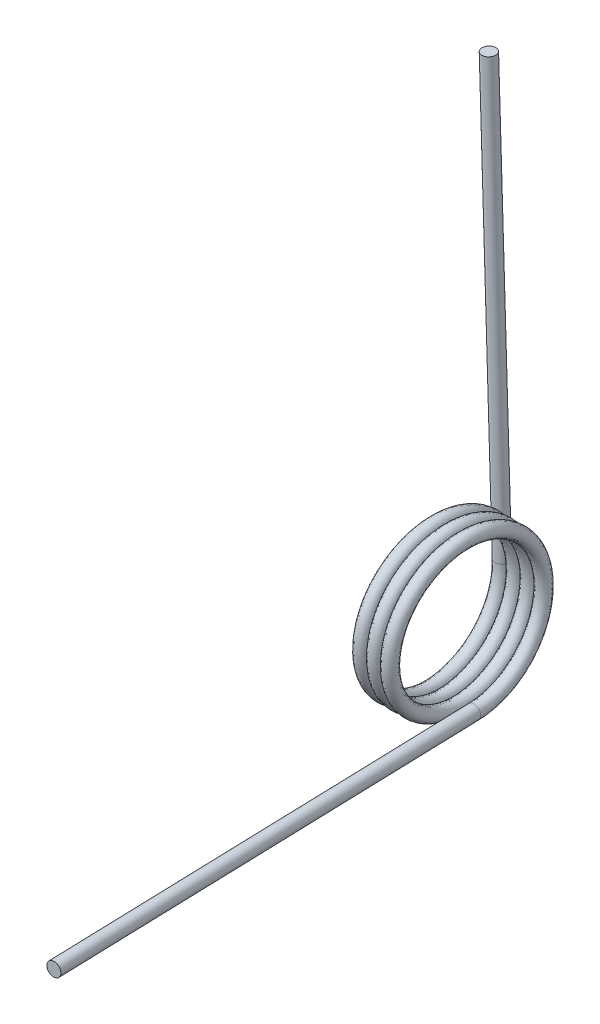
ISO-10303-21;
HEADER;
FILE_DESCRIPTION(('STEP AP214'),'2;1');
FILE_NAME('part.step','',(''),(''),'','','');
FILE_SCHEMA(('AUTOMOTIVE_DESIGN { 1 0 10303 214 1 1 1 1 }'));
ENDSEC;
DATA;
#1=APPLICATION_CONTEXT('core data for automotive mechanical design processes');
#2=APPLICATION_PROTOCOL_DEFINITION('international standard','automotive_design',2000,#1);
#3=PRODUCT_CONTEXT('',#1,'mechanical');
#4=PRODUCT('Part','Part','',(#3));
#5=PRODUCT_RELATED_PRODUCT_CATEGORY('part','',(#4));
#6=PRODUCT_DEFINITION_FORMATION('','',#4);
#7=PRODUCT_DEFINITION_CONTEXT('part definition',#1,'design');
#8=PRODUCT_DEFINITION('design','',#6,#7);
#9=PRODUCT_DEFINITION_SHAPE('','',#8);
#10=(LENGTH_UNIT() NAMED_UNIT(*) SI_UNIT(.MILLI.,.METRE.));
#11=(NAMED_UNIT(*) PLANE_ANGLE_UNIT() SI_UNIT($,.RADIAN.));
#12=(NAMED_UNIT(*) SI_UNIT($,.STERADIAN.) SOLID_ANGLE_UNIT());
#13=UNCERTAINTY_MEASURE_WITH_UNIT(LENGTH_MEASURE(1.E-05),#10,'distance_accuracy_value','');
#14=(GEOMETRIC_REPRESENTATION_CONTEXT(3) GLOBAL_UNCERTAINTY_ASSIGNED_CONTEXT((#13)) GLOBAL_UNIT_ASSIGNED_CONTEXT((#10,
#11,#12)) REPRESENTATION_CONTEXT('',''));
#15=CARTESIAN_POINT('',(0.,0.,0.));
#16=DIRECTION('',(0.,0.,1.));
#17=DIRECTION('',(1.,0.,0.));
#18=AXIS2_PLACEMENT_3D('',#15,#16,#17);
#19=CARTESIAN_POINT('',(1.20595359726786,0.0363066279997727,-12.8905));
#20=CARTESIAN_POINT('',(1.40915359726786,-7.4060270169891,-12.911461641449));
#21=CARTESIAN_POINT('',(1.61235359726786,-11.1453471534834,-6.47669246217356));
#22=CARTESIAN_POINT('',(1.81555359726786,-14.8846672899777,-0.0419232828980737));
#23=CARTESIAN_POINT('',(2.01875359726786,-11.1816537814832,6.41380753782644));
#24=CARTESIAN_POINT('',(2.22195359726786,-7.47864027298865,12.869538358551));
#25=CARTESIAN_POINT('',(2.42515359726785,-0.0363066279997743,12.8905));
#26=CARTESIAN_POINT('',(2.62835359726785,7.40602701698909,12.911461641449));
#27=CARTESIAN_POINT('',(2.83155359726785,11.1453471534834,6.47669246217356));
#28=CARTESIAN_POINT('',(3.03475359726785,14.8846672899777,0.0419232828980755));
#29=CARTESIAN_POINT('',(3.23795359726785,11.1816537814832,-6.41380753782644));
#30=CARTESIAN_POINT('',(3.44115359726785,7.47864027298865,-12.869538358551));
#31=CARTESIAN_POINT('',(3.64435359726785,0.0363066279997727,-12.8905));
#32=CARTESIAN_POINT('',(3.84755359726785,-7.4060270169891,-12.911461641449));
#33=CARTESIAN_POINT('',(4.05075359726785,-11.1453471534834,-6.47669246217356));
#34=CARTESIAN_POINT('',(4.25395359726785,-14.8846672899777,-0.0419232828980737));
#35=CARTESIAN_POINT('',(4.45715359726785,-11.1816537814832,6.41380753782644));
#36=CARTESIAN_POINT('',(4.66035359726785,-7.47864027298865,12.869538358551));
#37=CARTESIAN_POINT('',(4.86355359726785,-0.0363066279997743,12.8905));
#38=CARTESIAN_POINT('',(5.06675359726785,7.40602701698909,12.911461641449));
#39=CARTESIAN_POINT('',(5.26995359726785,11.1453471534834,6.47669246217356));
#40=CARTESIAN_POINT('',(5.47315359726785,14.8846672899777,0.0419232828980755));
#41=CARTESIAN_POINT('',(5.67635359726785,11.1816537814832,-6.41380753782644));
#42=CARTESIAN_POINT('',(5.87955359726785,7.47864027298865,-12.869538358551));
#43=CARTESIAN_POINT('',(6.08275359726785,0.0363066279997727,-12.8905));
#44=CARTESIAN_POINT('',(6.28595359726785,-7.4060270169891,-12.911461641449));
#45=CARTESIAN_POINT('',(6.48915359726784,-11.1453471534834,-6.47669246217356));
#46=CARTESIAN_POINT('',(6.69235359726784,-14.8846672899777,-0.0419232828980737));
#47=CARTESIAN_POINT('',(6.89555359726784,-11.1816537814832,6.41380753782644));
#48=CARTESIAN_POINT('',(7.09875359726784,-7.47864027298865,12.869538358551));
#49=CARTESIAN_POINT('',(7.30195359726784,-0.0363066279997743,12.8905));
#50=CARTESIAN_POINT('',(7.50515359726784,7.40602701698909,12.911461641449));
#51=CARTESIAN_POINT('',(7.70835359726784,11.1453471534834,6.47669246217356));
#52=CARTESIAN_POINT('',(7.91155359726784,14.8846672899777,0.0419232828980755));
#53=CARTESIAN_POINT('',(8.11475359726784,11.1816537814832,-6.41380753782644));
#54=CARTESIAN_POINT('',(8.31795359726784,7.47864027298865,-12.869538358551));
#55=CARTESIAN_POINT('',(8.52115359726784,0.0363066279997727,-12.8905));
#56=CARTESIAN_POINT('',(8.72435359726784,-7.4060270169891,-12.911461641449));
#57=CARTESIAN_POINT('',(8.92755359726784,-11.1453471534834,-6.47669246217356));
#58=CARTESIAN_POINT('',(9.13075359726784,-14.8846672899777,-0.0419232828980737));
#59=CARTESIAN_POINT('',(9.33395359726784,-11.1816537814832,6.41380753782644));
#60=CARTESIAN_POINT('',(9.53715359726784,-7.47864027298865,12.869538358551));
#61=CARTESIAN_POINT('',(9.74035359726784,-0.0363066279997743,12.8905));
#62=CARTESIAN_POINT('',(9.94355359726783,7.40602701698909,12.911461641449));
#63=CARTESIAN_POINT('',(10.1467535972678,11.1453471534834,6.47669246217356));
#64=CARTESIAN_POINT('',(10.3499535972678,14.8846672899777,0.0419232828980755));
#65=CARTESIAN_POINT('',(10.5531535972678,11.1816537814832,-6.41380753782644));
#66=CARTESIAN_POINT('',(10.7563535972678,7.47864027298865,-12.869538358551));
#67=CARTESIAN_POINT('',(10.9595535972678,0.0363066279997727,-12.8905));
#68=CARTESIAN_POINT('',(1.20595359726786,0.0363066279997727,-10.4775));
#69=CARTESIAN_POINT('',(1.40915359726786,-6.01288081743453,-10.498461641449));
#70=CARTESIAN_POINT('',(1.61235359726786,-9.05562785415157,-5.27019246217355));
#71=CARTESIAN_POINT('',(1.81555359726786,-12.0983748908686,-0.0419232828980735));
#72=CARTESIAN_POINT('',(2.01875359726786,-9.09193448215134,5.20730753782644));
#73=CARTESIAN_POINT('',(2.22195359726786,-6.08549407343408,10.456538358551));
#74=CARTESIAN_POINT('',(2.42515359726785,-0.036306627999774,10.4775));
#75=CARTESIAN_POINT('',(2.62835359726785,6.01288081743453,10.498461641449));
#76=CARTESIAN_POINT('',(2.83155359726785,9.05562785415156,5.27019246217356));
#77=CARTESIAN_POINT('',(3.03475359726785,12.0983748908686,0.041923282898075));
#78=CARTESIAN_POINT('',(3.23795359726785,9.09193448215135,-5.20730753782644));
#79=CARTESIAN_POINT('',(3.44115359726785,6.08549407343408,-10.456538358551));
#80=CARTESIAN_POINT('',(3.64435359726785,0.0363066279997727,-10.4775));
#81=CARTESIAN_POINT('',(3.84755359726785,-6.01288081743453,-10.498461641449));
#82=CARTESIAN_POINT('',(4.05075359726785,-9.05562785415157,-5.27019246217355));
#83=CARTESIAN_POINT('',(4.25395359726785,-12.0983748908686,-0.0419232828980735));
#84=CARTESIAN_POINT('',(4.45715359726785,-9.09193448215134,5.20730753782644));
#85=CARTESIAN_POINT('',(4.66035359726785,-6.08549407343408,10.456538358551));
#86=CARTESIAN_POINT('',(4.86355359726785,-0.036306627999774,10.4775));
#87=CARTESIAN_POINT('',(5.06675359726785,6.01288081743453,10.498461641449));
#88=CARTESIAN_POINT('',(5.26995359726785,9.05562785415156,5.27019246217356));
#89=CARTESIAN_POINT('',(5.47315359726785,12.0983748908686,0.041923282898075));
#90=CARTESIAN_POINT('',(5.67635359726785,9.09193448215135,-5.20730753782644));
#91=CARTESIAN_POINT('',(5.87955359726785,6.08549407343408,-10.456538358551));
#92=CARTESIAN_POINT('',(6.08275359726785,0.0363066279997727,-10.4775));
#93=CARTESIAN_POINT('',(6.28595359726785,-6.01288081743453,-10.498461641449));
#94=CARTESIAN_POINT('',(6.48915359726785,-9.05562785415157,-5.27019246217355));
#95=CARTESIAN_POINT('',(6.69235359726784,-12.0983748908686,-0.0419232828980735));
#96=CARTESIAN_POINT('',(6.89555359726784,-9.09193448215134,5.20730753782644));
#97=CARTESIAN_POINT('',(7.09875359726784,-6.08549407343408,10.456538358551));
#98=CARTESIAN_POINT('',(7.30195359726784,-0.036306627999774,10.4775));
#99=CARTESIAN_POINT('',(7.50515359726784,6.01288081743453,10.498461641449));
#100=CARTESIAN_POINT('',(7.70835359726784,9.05562785415156,5.27019246217356));
#101=CARTESIAN_POINT('',(7.91155359726784,12.0983748908686,0.041923282898075));
#102=CARTESIAN_POINT('',(8.11475359726784,9.09193448215135,-5.20730753782644));
#103=CARTESIAN_POINT('',(8.31795359726784,6.08549407343408,-10.456538358551));
#104=CARTESIAN_POINT('',(8.52115359726784,0.0363066279997727,-10.4775));
#105=CARTESIAN_POINT('',(8.72435359726784,-6.01288081743453,-10.498461641449));
#106=CARTESIAN_POINT('',(8.92755359726784,-9.05562785415157,-5.27019246217355));
#107=CARTESIAN_POINT('',(9.13075359726784,-12.0983748908686,-0.0419232828980735));
#108=CARTESIAN_POINT('',(9.33395359726784,-9.09193448215134,5.20730753782644));
#109=CARTESIAN_POINT('',(9.53715359726784,-6.08549407343408,10.456538358551));
#110=CARTESIAN_POINT('',(9.74035359726784,-0.036306627999774,10.4775));
#111=CARTESIAN_POINT('',(9.94355359726784,6.01288081743453,10.498461641449));
#112=CARTESIAN_POINT('',(10.1467535972678,9.05562785415156,5.27019246217356));
#113=CARTESIAN_POINT('',(10.3499535972678,12.0983748908686,0.041923282898075));
#114=CARTESIAN_POINT('',(10.5531535972678,9.09193448215135,-5.20730753782644));
#115=CARTESIAN_POINT('',(10.7563535972678,6.08549407343408,-10.456538358551));
#116=CARTESIAN_POINT('',(10.9595535972678,0.0363066279997727,-10.4775));
#117=CARTESIAN_POINT('',(-1.20595359726786,-0.0363066279997727,-10.4775));
#118=CARTESIAN_POINT('',(-1.00275359726786,-6.08549407343408,-10.456538358551));
#119=CARTESIAN_POINT('',(-0.799553597267859,-9.09193448215134,-5.20730753782645));
#120=CARTESIAN_POINT('',(-0.596353597267859,-12.0983748908686,0.041923282898072));
#121=CARTESIAN_POINT('',(-0.39315359726786,-9.05562785415157,5.27019246217355));
#122=CARTESIAN_POINT('',(-0.18995359726786,-6.01288081743453,10.498461641449));
#123=CARTESIAN_POINT('',(0.0132464027321393,0.0363066279997714,10.4775));
#124=CARTESIAN_POINT('',(0.216446402732139,6.08549407343407,10.456538358551));
#125=CARTESIAN_POINT('',(0.419646402732138,9.09193448215134,5.20730753782645));
#126=CARTESIAN_POINT('',(0.622846402732138,12.0983748908686,-0.0419232828980705));
#127=CARTESIAN_POINT('',(0.826046402732137,9.05562785415157,-5.27019246217355));
#128=CARTESIAN_POINT('',(1.02924640273214,6.01288081743454,-10.498461641449));
#129=CARTESIAN_POINT('',(1.23244640273214,-0.0363066279997727,-10.4775));
#130=CARTESIAN_POINT('',(1.43564640273214,-6.08549407343408,-10.456538358551));
#131=CARTESIAN_POINT('',(1.63884640273214,-9.09193448215134,-5.20730753782645));
#132=CARTESIAN_POINT('',(1.84204640273213,-12.0983748908686,0.041923282898072));
#133=CARTESIAN_POINT('',(2.04524640273213,-9.05562785415157,5.27019246217355));
#134=CARTESIAN_POINT('',(2.24844640273213,-6.01288081743453,10.498461641449));
#135=CARTESIAN_POINT('',(2.45164640273213,0.0363066279997714,10.4775));
#136=CARTESIAN_POINT('',(2.65484640273213,6.08549407343407,10.456538358551));
#137=CARTESIAN_POINT('',(2.85804640273213,9.09193448215134,5.20730753782645));
#138=CARTESIAN_POINT('',(3.06124640273213,12.0983748908686,-0.0419232828980705));
#139=CARTESIAN_POINT('',(3.26444640273213,9.05562785415157,-5.27019246217355));
#140=CARTESIAN_POINT('',(3.46764640273213,6.01288081743454,-10.498461641449));
#141=CARTESIAN_POINT('',(3.67084640273213,-0.0363066279997727,-10.4775));
#142=CARTESIAN_POINT('',(3.87404640273213,-6.08549407343408,-10.456538358551));
#143=CARTESIAN_POINT('',(4.07724640273213,-9.09193448215134,-5.20730753782645));
#144=CARTESIAN_POINT('',(4.28044640273213,-12.0983748908686,0.041923282898072));
#145=CARTESIAN_POINT('',(4.48364640273213,-9.05562785415157,5.27019246217355));
#146=CARTESIAN_POINT('',(4.68684640273213,-6.01288081743453,10.498461641449));
#147=CARTESIAN_POINT('',(4.89004640273213,0.0363066279997714,10.4775));
#148=CARTESIAN_POINT('',(5.09324640273213,6.08549407343407,10.456538358551));
#149=CARTESIAN_POINT('',(5.29644640273213,9.09193448215134,5.20730753782645));
#150=CARTESIAN_POINT('',(5.49964640273213,12.0983748908686,-0.0419232828980705));
#151=CARTESIAN_POINT('',(5.70284640273213,9.05562785415157,-5.27019246217355));
#152=CARTESIAN_POINT('',(5.90604640273212,6.01288081743454,-10.498461641449));
#153=CARTESIAN_POINT('',(6.10924640273212,-0.0363066279997727,-10.4775));
#154=CARTESIAN_POINT('',(6.31244640273212,-6.08549407343408,-10.456538358551));
#155=CARTESIAN_POINT('',(6.51564640273212,-9.09193448215134,-5.20730753782645));
#156=CARTESIAN_POINT('',(6.71884640273212,-12.0983748908686,0.041923282898072));
#157=CARTESIAN_POINT('',(6.92204640273212,-9.05562785415157,5.27019246217355));
#158=CARTESIAN_POINT('',(7.12524640273212,-6.01288081743453,10.498461641449));
#159=CARTESIAN_POINT('',(7.32844640273212,0.0363066279997714,10.4775));
#160=CARTESIAN_POINT('',(7.53164640273212,6.08549407343407,10.456538358551));
#161=CARTESIAN_POINT('',(7.73484640273212,9.09193448215134,5.20730753782645));
#162=CARTESIAN_POINT('',(7.93804640273212,12.0983748908686,-0.0419232828980705));
#163=CARTESIAN_POINT('',(8.14124640273212,9.05562785415157,-5.27019246217355));
#164=CARTESIAN_POINT('',(8.34444640273212,6.01288081743454,-10.498461641449));
#165=CARTESIAN_POINT('',(8.54764640273212,-0.0363066279997727,-10.4775));
#166=CARTESIAN_POINT('',(-1.20595359726786,-0.0363066279997727,-12.8905));
#167=CARTESIAN_POINT('',(-1.00275359726786,-7.47864027298864,-12.869538358551));
#168=CARTESIAN_POINT('',(-0.799553597267859,-11.1816537814832,-6.41380753782645));
#169=CARTESIAN_POINT('',(-0.596353597267859,-14.8846672899777,0.0419232828980719));
#170=CARTESIAN_POINT('',(-0.39315359726786,-11.1453471534834,6.47669246217355));
#171=CARTESIAN_POINT('',(-0.18995359726786,-7.4060270169891,12.911461641449));
#172=CARTESIAN_POINT('',(0.013246402732139,0.0363066279997711,12.8905));
#173=CARTESIAN_POINT('',(0.216446402732139,7.47864027298864,12.869538358551));
#174=CARTESIAN_POINT('',(0.419646402732138,11.1816537814832,6.41380753782645));
#175=CARTESIAN_POINT('',(0.622846402732138,14.8846672899777,-0.04192328289807));
#176=CARTESIAN_POINT('',(0.826046402732137,11.1453471534834,-6.47669246217354));
#177=CARTESIAN_POINT('',(1.02924640273214,7.4060270169891,-12.911461641449));
#178=CARTESIAN_POINT('',(1.23244640273214,-0.0363066279997727,-12.8905));
#179=CARTESIAN_POINT('',(1.43564640273214,-7.47864027298864,-12.869538358551));
#180=CARTESIAN_POINT('',(1.63884640273213,-11.1816537814832,-6.41380753782645));
#181=CARTESIAN_POINT('',(1.84204640273213,-14.8846672899777,0.0419232828980719));
#182=CARTESIAN_POINT('',(2.04524640273213,-11.1453471534834,6.47669246217355));
#183=CARTESIAN_POINT('',(2.24844640273213,-7.4060270169891,12.911461641449));
#184=CARTESIAN_POINT('',(2.45164640273213,0.0363066279997711,12.8905));
#185=CARTESIAN_POINT('',(2.65484640273213,7.47864027298864,12.869538358551));
#186=CARTESIAN_POINT('',(2.85804640273213,11.1816537814832,6.41380753782645));
#187=CARTESIAN_POINT('',(3.06124640273213,14.8846672899777,-0.04192328289807));
#188=CARTESIAN_POINT('',(3.26444640273213,11.1453471534834,-6.47669246217354));
#189=CARTESIAN_POINT('',(3.46764640273213,7.4060270169891,-12.911461641449));
#190=CARTESIAN_POINT('',(3.67084640273213,-0.0363066279997727,-12.8905));
#191=CARTESIAN_POINT('',(3.87404640273213,-7.47864027298864,-12.869538358551));
#192=CARTESIAN_POINT('',(4.07724640273213,-11.1816537814832,-6.41380753782645));
#193=CARTESIAN_POINT('',(4.28044640273213,-14.8846672899777,0.0419232828980719));
#194=CARTESIAN_POINT('',(4.48364640273213,-11.1453471534834,6.47669246217355));
#195=CARTESIAN_POINT('',(4.68684640273213,-7.4060270169891,12.911461641449));
#196=CARTESIAN_POINT('',(4.89004640273213,0.0363066279997711,12.8905));
#197=CARTESIAN_POINT('',(5.09324640273213,7.47864027298864,12.869538358551));
#198=CARTESIAN_POINT('',(5.29644640273213,11.1816537814832,6.41380753782645));
#199=CARTESIAN_POINT('',(5.49964640273213,14.8846672899777,-0.04192328289807));
#200=CARTESIAN_POINT('',(5.70284640273213,11.1453471534834,-6.47669246217354));
#201=CARTESIAN_POINT('',(5.90604640273212,7.4060270169891,-12.911461641449));
#202=CARTESIAN_POINT('',(6.10924640273212,-0.0363066279997727,-12.8905));
#203=CARTESIAN_POINT('',(6.31244640273212,-7.47864027298864,-12.869538358551));
#204=CARTESIAN_POINT('',(6.51564640273212,-11.1816537814832,-6.41380753782645));
#205=CARTESIAN_POINT('',(6.71884640273212,-14.8846672899777,0.0419232828980719));
#206=CARTESIAN_POINT('',(6.92204640273212,-11.1453471534834,6.47669246217355));
#207=CARTESIAN_POINT('',(7.12524640273212,-7.4060270169891,12.911461641449));
#208=CARTESIAN_POINT('',(7.32844640273212,0.0363066279997711,12.8905));
#209=CARTESIAN_POINT('',(7.53164640273212,7.47864027298864,12.869538358551));
#210=CARTESIAN_POINT('',(7.73484640273212,11.1816537814832,6.41380753782645));
#211=CARTESIAN_POINT('',(7.93804640273212,14.8846672899777,-0.04192328289807));
#212=CARTESIAN_POINT('',(8.14124640273212,11.1453471534834,-6.47669246217354));
#213=CARTESIAN_POINT('',(8.34444640273212,7.4060270169891,-12.911461641449));
#214=CARTESIAN_POINT('',(8.54764640273212,-0.0363066279997727,-12.8905));
#215=CARTESIAN_POINT('',(-1.20595359726786,-0.0363066279997727,-15.3035));
#216=CARTESIAN_POINT('',(-1.00275359726786,-8.87178647254321,-15.282538358551));
#217=CARTESIAN_POINT('',(-0.799553597267859,-13.271373080815,-7.62030753782645));
#218=CARTESIAN_POINT('',(-0.59635359726786,-17.6709596890869,0.0419232828980717));
#219=CARTESIAN_POINT('',(-0.39315359726786,-13.2350664528153,7.68319246217355));
#220=CARTESIAN_POINT('',(-0.189953597267861,-8.79917321654367,15.324461641449));
#221=CARTESIAN_POINT('',(0.0132464027321388,0.0363066279997709,15.3035));
#222=CARTESIAN_POINT('',(0.216446402732138,8.8717864725432,15.282538358551));
#223=CARTESIAN_POINT('',(0.419646402732138,13.271373080815,7.62030753782645));
#224=CARTESIAN_POINT('',(0.622846402732137,17.6709596890869,-0.0419232828980695));
#225=CARTESIAN_POINT('',(0.826046402732137,13.2350664528153,-7.68319246217354));
#226=CARTESIAN_POINT('',(1.02924640273214,8.79917321654367,-15.324461641449));
#227=CARTESIAN_POINT('',(1.23244640273214,-0.0363066279997727,-15.3035));
#228=CARTESIAN_POINT('',(1.43564640273214,-8.87178647254321,-15.282538358551));
#229=CARTESIAN_POINT('',(1.63884640273213,-13.271373080815,-7.62030753782645));
#230=CARTESIAN_POINT('',(1.84204640273213,-17.6709596890869,0.0419232828980717));
#231=CARTESIAN_POINT('',(2.04524640273213,-13.2350664528153,7.68319246217355));
#232=CARTESIAN_POINT('',(2.24844640273213,-8.79917321654367,15.324461641449));
#233=CARTESIAN_POINT('',(2.45164640273213,0.0363066279997709,15.3035));
#234=CARTESIAN_POINT('',(2.65484640273213,8.8717864725432,15.282538358551));
#235=CARTESIAN_POINT('',(2.85804640273213,13.271373080815,7.62030753782645));
#236=CARTESIAN_POINT('',(3.06124640273213,17.6709596890869,-0.0419232828980695));
#237=CARTESIAN_POINT('',(3.26444640273213,13.2350664528153,-7.68319246217354));
#238=CARTESIAN_POINT('',(3.46764640273213,8.79917321654367,-15.324461641449));
#239=CARTESIAN_POINT('',(3.67084640273213,-0.0363066279997727,-15.3035));
#240=CARTESIAN_POINT('',(3.87404640273213,-8.87178647254321,-15.282538358551));
#241=CARTESIAN_POINT('',(4.07724640273213,-13.271373080815,-7.62030753782645));
#242=CARTESIAN_POINT('',(4.28044640273213,-17.6709596890869,0.0419232828980717));
#243=CARTESIAN_POINT('',(4.48364640273213,-13.2350664528153,7.68319246217355));
#244=CARTESIAN_POINT('',(4.68684640273213,-8.79917321654367,15.324461641449));
#245=CARTESIAN_POINT('',(4.89004640273213,0.0363066279997709,15.3035));
#246=CARTESIAN_POINT('',(5.09324640273213,8.8717864725432,15.282538358551));
#247=CARTESIAN_POINT('',(5.29644640273213,13.271373080815,7.62030753782645));
#248=CARTESIAN_POINT('',(5.49964640273213,17.6709596890869,-0.0419232828980695));
#249=CARTESIAN_POINT('',(5.70284640273213,13.2350664528153,-7.68319246217354));
#250=CARTESIAN_POINT('',(5.90604640273212,8.79917321654367,-15.324461641449));
#251=CARTESIAN_POINT('',(6.10924640273212,-0.0363066279997727,-15.3035));
#252=CARTESIAN_POINT('',(6.31244640273212,-8.87178647254321,-15.282538358551));
#253=CARTESIAN_POINT('',(6.51564640273212,-13.271373080815,-7.62030753782645));
#254=CARTESIAN_POINT('',(6.71884640273212,-17.6709596890869,0.0419232828980717));
#255=CARTESIAN_POINT('',(6.92204640273212,-13.2350664528153,7.68319246217355));
#256=CARTESIAN_POINT('',(7.12524640273212,-8.79917321654367,15.324461641449));
#257=CARTESIAN_POINT('',(7.32844640273212,0.0363066279997709,15.3035));
#258=CARTESIAN_POINT('',(7.53164640273212,8.8717864725432,15.282538358551));
#259=CARTESIAN_POINT('',(7.73484640273212,13.271373080815,7.62030753782645));
#260=CARTESIAN_POINT('',(7.93804640273212,17.6709596890869,-0.0419232828980695));
#261=CARTESIAN_POINT('',(8.14124640273212,13.2350664528153,-7.68319246217354));
#262=CARTESIAN_POINT('',(8.34444640273212,8.79917321654367,-15.324461641449));
#263=CARTESIAN_POINT('',(8.54764640273212,-0.0363066279997727,-15.3035));
#264=CARTESIAN_POINT('',(1.20595359726786,0.0363066279997727,-15.3035));
#265=CARTESIAN_POINT('',(1.40915359726786,-8.79917321654366,-15.324461641449));
#266=CARTESIAN_POINT('',(1.61235359726786,-13.2350664528153,-7.68319246217356));
#267=CARTESIAN_POINT('',(1.81555359726786,-17.6709596890869,-0.0419232828980739));
#268=CARTESIAN_POINT('',(2.01875359726786,-13.271373080815,7.62030753782644));
#269=CARTESIAN_POINT('',(2.22195359726786,-8.87178647254322,15.282538358551));
#270=CARTESIAN_POINT('',(2.42515359726785,-0.0363066279997746,15.3035));
#271=CARTESIAN_POINT('',(2.62835359726785,8.79917321654366,15.324461641449));
#272=CARTESIAN_POINT('',(2.83155359726785,13.2350664528153,7.68319246217356));
#273=CARTESIAN_POINT('',(3.03475359726785,17.6709596890869,0.041923282898076));
#274=CARTESIAN_POINT('',(3.23795359726785,13.271373080815,-7.62030753782643));
#275=CARTESIAN_POINT('',(3.44115359726785,8.87178647254322,-15.282538358551));
#276=CARTESIAN_POINT('',(3.64435359726785,0.0363066279997727,-15.3035));
#277=CARTESIAN_POINT('',(3.84755359726785,-8.79917321654366,-15.324461641449));
#278=CARTESIAN_POINT('',(4.05075359726785,-13.2350664528153,-7.68319246217356));
#279=CARTESIAN_POINT('',(4.25395359726785,-17.6709596890869,-0.0419232828980739));
#280=CARTESIAN_POINT('',(4.45715359726785,-13.271373080815,7.62030753782644));
#281=CARTESIAN_POINT('',(4.66035359726785,-8.87178647254322,15.282538358551));
#282=CARTESIAN_POINT('',(4.86355359726785,-0.0363066279997746,15.3035));
#283=CARTESIAN_POINT('',(5.06675359726785,8.79917321654366,15.324461641449));
#284=CARTESIAN_POINT('',(5.26995359726785,13.2350664528153,7.68319246217356));
#285=CARTESIAN_POINT('',(5.47315359726785,17.6709596890869,0.041923282898076));
#286=CARTESIAN_POINT('',(5.67635359726785,13.271373080815,-7.62030753782643));
#287=CARTESIAN_POINT('',(5.87955359726785,8.87178647254322,-15.282538358551));
#288=CARTESIAN_POINT('',(6.08275359726785,0.0363066279997727,-15.3035));
#289=CARTESIAN_POINT('',(6.28595359726785,-8.79917321654366,-15.324461641449));
#290=CARTESIAN_POINT('',(6.48915359726785,-13.2350664528153,-7.68319246217356));
#291=CARTESIAN_POINT('',(6.69235359726784,-17.6709596890869,-0.0419232828980739));
#292=CARTESIAN_POINT('',(6.89555359726784,-13.271373080815,7.62030753782644));
#293=CARTESIAN_POINT('',(7.09875359726784,-8.87178647254322,15.282538358551));
#294=CARTESIAN_POINT('',(7.30195359726784,-0.0363066279997746,15.3035));
#295=CARTESIAN_POINT('',(7.50515359726784,8.79917321654366,15.324461641449));
#296=CARTESIAN_POINT('',(7.70835359726784,13.2350664528153,7.68319246217356));
#297=CARTESIAN_POINT('',(7.91155359726784,17.6709596890869,0.041923282898076));
#298=CARTESIAN_POINT('',(8.11475359726784,13.271373080815,-7.62030753782643));
#299=CARTESIAN_POINT('',(8.31795359726784,8.87178647254322,-15.282538358551));
#300=CARTESIAN_POINT('',(8.52115359726784,0.0363066279997727,-15.3035));
#301=CARTESIAN_POINT('',(8.72435359726784,-8.79917321654366,-15.324461641449));
#302=CARTESIAN_POINT('',(8.92755359726784,-13.2350664528153,-7.68319246217356));
#303=CARTESIAN_POINT('',(9.13075359726784,-17.6709596890869,-0.0419232828980739));
#304=CARTESIAN_POINT('',(9.33395359726784,-13.271373080815,7.62030753782644));
#305=CARTESIAN_POINT('',(9.53715359726784,-8.87178647254322,15.282538358551));
#306=CARTESIAN_POINT('',(9.74035359726784,-0.0363066279997746,15.3035));
#307=CARTESIAN_POINT('',(9.94355359726784,8.79917321654366,15.324461641449));
#308=CARTESIAN_POINT('',(10.1467535972678,13.2350664528153,7.68319246217356));
#309=CARTESIAN_POINT('',(10.3499535972678,17.6709596890869,0.041923282898076));
#310=CARTESIAN_POINT('',(10.5531535972678,13.271373080815,-7.62030753782643));
#311=CARTESIAN_POINT('',(10.7563535972678,8.87178647254322,-15.282538358551));
#312=CARTESIAN_POINT('',(10.9595535972678,0.0363066279997727,-15.3035));
#313=CARTESIAN_POINT('',(1.20595359726786,0.0363066279997727,-12.8905));
#314=CARTESIAN_POINT('',(1.40915359726786,-7.4060270169891,-12.911461641449));
#315=CARTESIAN_POINT('',(1.61235359726786,-11.1453471534834,-6.47669246217356));
#316=CARTESIAN_POINT('',(1.81555359726786,-14.8846672899777,-0.0419232828980737));
#317=CARTESIAN_POINT('',(2.01875359726786,-11.1816537814832,6.41380753782644));
#318=CARTESIAN_POINT('',(2.22195359726786,-7.47864027298865,12.869538358551));
#319=CARTESIAN_POINT('',(2.42515359726785,-0.0363066279997743,12.8905));
#320=CARTESIAN_POINT('',(2.62835359726785,7.40602701698909,12.911461641449));
#321=CARTESIAN_POINT('',(2.83155359726785,11.1453471534834,6.47669246217356));
#322=CARTESIAN_POINT('',(3.03475359726785,14.8846672899777,0.0419232828980755));
#323=CARTESIAN_POINT('',(3.23795359726785,11.1816537814832,-6.41380753782644));
#324=CARTESIAN_POINT('',(3.44115359726785,7.47864027298865,-12.869538358551));
#325=CARTESIAN_POINT('',(3.64435359726785,0.0363066279997727,-12.8905));
#326=CARTESIAN_POINT('',(3.84755359726785,-7.4060270169891,-12.911461641449));
#327=CARTESIAN_POINT('',(4.05075359726785,-11.1453471534834,-6.47669246217356));
#328=CARTESIAN_POINT('',(4.25395359726785,-14.8846672899777,-0.0419232828980737));
#329=CARTESIAN_POINT('',(4.45715359726785,-11.1816537814832,6.41380753782644));
#330=CARTESIAN_POINT('',(4.66035359726785,-7.47864027298865,12.869538358551));
#331=CARTESIAN_POINT('',(4.86355359726785,-0.0363066279997743,12.8905));
#332=CARTESIAN_POINT('',(5.06675359726785,7.40602701698909,12.911461641449));
#333=CARTESIAN_POINT('',(5.26995359726785,11.1453471534834,6.47669246217356));
#334=CARTESIAN_POINT('',(5.47315359726785,14.8846672899777,0.0419232828980755));
#335=CARTESIAN_POINT('',(5.67635359726785,11.1816537814832,-6.41380753782644));
#336=CARTESIAN_POINT('',(5.87955359726785,7.47864027298865,-12.869538358551));
#337=CARTESIAN_POINT('',(6.08275359726785,0.0363066279997727,-12.8905));
#338=CARTESIAN_POINT('',(6.28595359726785,-7.4060270169891,-12.911461641449));
#339=CARTESIAN_POINT('',(6.48915359726784,-11.1453471534834,-6.47669246217356));
#340=CARTESIAN_POINT('',(6.69235359726784,-14.8846672899777,-0.0419232828980737));
#341=CARTESIAN_POINT('',(6.89555359726784,-11.1816537814832,6.41380753782644));
#342=CARTESIAN_POINT('',(7.09875359726784,-7.47864027298865,12.869538358551));
#343=CARTESIAN_POINT('',(7.30195359726784,-0.0363066279997743,12.8905));
#344=CARTESIAN_POINT('',(7.50515359726784,7.40602701698909,12.911461641449));
#345=CARTESIAN_POINT('',(7.70835359726784,11.1453471534834,6.47669246217356));
#346=CARTESIAN_POINT('',(7.91155359726784,14.8846672899777,0.0419232828980755));
#347=CARTESIAN_POINT('',(8.11475359726784,11.1816537814832,-6.41380753782644));
#348=CARTESIAN_POINT('',(8.31795359726784,7.47864027298865,-12.869538358551));
#349=CARTESIAN_POINT('',(8.52115359726784,0.0363066279997727,-12.8905));
#350=CARTESIAN_POINT('',(8.72435359726784,-7.4060270169891,-12.911461641449));
#351=CARTESIAN_POINT('',(8.92755359726784,-11.1453471534834,-6.47669246217356));
#352=CARTESIAN_POINT('',(9.13075359726784,-14.8846672899777,-0.0419232828980737));
#353=CARTESIAN_POINT('',(9.33395359726784,-11.1816537814832,6.41380753782644));
#354=CARTESIAN_POINT('',(9.53715359726784,-7.47864027298865,12.869538358551));
#355=CARTESIAN_POINT('',(9.74035359726784,-0.0363066279997743,12.8905));
#356=CARTESIAN_POINT('',(9.94355359726783,7.40602701698909,12.911461641449));
#357=CARTESIAN_POINT('',(10.1467535972678,11.1453471534834,6.47669246217356));
#358=CARTESIAN_POINT('',(10.3499535972678,14.8846672899777,0.0419232828980755));
#359=CARTESIAN_POINT('',(10.5531535972678,11.1816537814832,-6.41380753782644));
#360=CARTESIAN_POINT('',(10.7563535972678,7.47864027298865,-12.869538358551));
#361=CARTESIAN_POINT('',(10.9595535972678,0.0363066279997727,-12.8905));
#362=(BOUNDED_SURFACE() B_SPLINE_SURFACE(3,2,((#19,#20,#21,#22,#23,#24,#25,#26,#27,#28,#29,#30,
#31,#32,#33,#34,#35,#36,#37,#38,#39,#40,#41,#42,#43,#44,#45,#46,#47,#48,#49,#50,#51,#52,#53,#54,
#55,#56,#57,#58,#59,#60,#61,#62,#63,#64,#65,#66,#67),(#68,#69,#70,#71,#72,#73,#74,#75,#76,#77,
#78,#79,#80,#81,#82,#83,#84,#85,#86,#87,#88,#89,#90,#91,#92,#93,#94,#95,#96,#97,#98,#99,#100,
#101,#102,#103,#104,#105,#106,#107,#108,#109,#110,#111,#112,#113,#114,#115,#116),(#117,#118,
#119,#120,#121,#122,#123,#124,#125,#126,#127,#128,#129,#130,#131,#132,#133,#134,#135,#136,#137,
#138,#139,#140,#141,#142,#143,#144,#145,#146,#147,#148,#149,#150,#151,#152,#153,#154,#155,#156,
#157,#158,#159,#160,#161,#162,#163,#164,#165),(#166,#167,#168,#169,#170,#171,#172,#173,#174,
#175,#176,#177,#178,#179,#180,#181,#182,#183,#184,#185,#186,#187,#188,#189,#190,#191,#192,#193,
#194,#195,#196,#197,#198,#199,#200,#201,#202,#203,#204,#205,#206,#207,#208,#209,#210,#211,#212,
#213,#214),(#215,#216,#217,#218,#219,#220,#221,#222,#223,#224,#225,#226,#227,#228,#229,#230,
#231,#232,#233,#234,#235,#236,#237,#238,#239,#240,#241,#242,#243,#244,#245,#246,#247,#248,#249,
#250,#251,#252,#253,#254,#255,#256,#257,#258,#259,#260,#261,#262,#263),(#264,#265,#266,#267,
#268,#269,#270,#271,#272,#273,#274,#275,#276,#277,#278,#279,#280,#281,#282,#283,#284,#285,#286,
#287,#288,#289,#290,#291,#292,#293,#294,#295,#296,#297,#298,#299,#300,#301,#302,#303,#304,#305,
#306,#307,#308,#309,#310,#311,#312),(#313,#314,#315,#316,#317,#318,#319,#320,#321,#322,#323,
#324,#325,#326,#327,#328,#329,#330,#331,#332,#333,#334,#335,#336,#337,#338,#339,#340,#341,#342,
#343,#344,#345,#346,#347,#348,#349,#350,#351,#352,#353,#354,#355,#356,#357,#358,#359,#360,
#361)),.UNSPECIFIED.,.T.,.F.,.F.) B_SPLINE_SURFACE_WITH_KNOTS((4,3,4),(3,2,2,2,2,2,2,2,2,2,2,2,
2,2,2,2,2,2,2,2,2,2,2,2,3),(0.,0.5,1.),(0.,0.0416666666666667,0.0833333333333333,0.125,
0.166666666666667,0.208333333333333,0.25,0.291666666666667,0.333333333333333,0.375,
0.416666666666667,0.458333333333333,0.5,0.541666666666667,0.583333333333333,0.625,
0.666666666666667,0.708333333333333,0.75,0.791666666666667,0.833333333333333,0.875,
0.916666666666667,0.958333333333333,1.),
.UNSPECIFIED.) GEOMETRIC_REPRESENTATION_ITEM() RATIONAL_B_SPLINE_SURFACE(((1.,0.866025403784439,
1.,0.866025403784439,1.,0.866025403784439,1.,0.866025403784439,1.,0.866025403784439,1.,
0.866025403784439,1.,0.866025403784439,1.,0.866025403784439,1.,0.866025403784439,1.,
0.866025403784439,1.,0.866025403784439,1.,0.866025403784439,1.,0.866025403784439,1.,
0.866025403784439,1.,0.866025403784439,1.,0.866025403784439,1.,0.866025403784439,1.,
0.866025403784439,1.,0.866025403784439,1.,0.866025403784439,1.,0.866025403784439,1.,
0.866025403784439,1.,0.866025403784439,1.,0.866025403784439,1.),(0.333333333333333,
0.288675134594813,0.333333333333333,0.288675134594813,0.333333333333333,0.288675134594813,
0.333333333333333,0.288675134594813,0.333333333333333,0.288675134594813,0.333333333333333,
0.288675134594813,0.333333333333333,0.288675134594813,0.333333333333333,0.288675134594813,
0.333333333333333,0.288675134594813,0.333333333333333,0.288675134594813,0.333333333333333,
0.288675134594813,0.333333333333333,0.288675134594813,0.333333333333333,0.288675134594813,
0.333333333333333,0.288675134594813,0.333333333333333,0.288675134594813,0.333333333333333,
0.288675134594813,0.333333333333333,0.288675134594813,0.333333333333333,0.288675134594813,
0.333333333333333,0.288675134594813,0.333333333333333,0.288675134594813,0.333333333333333,
0.288675134594813,0.333333333333333,0.288675134594813,0.333333333333333,0.288675134594813,
0.333333333333333,0.288675134594813,0.333333333333333),(0.333333333333333,0.288675134594813,
0.333333333333333,0.288675134594813,0.333333333333333,0.288675134594813,0.333333333333333,
0.288675134594813,0.333333333333333,0.288675134594813,0.333333333333333,0.288675134594813,
0.333333333333333,0.288675134594813,0.333333333333333,0.288675134594813,0.333333333333333,
0.288675134594813,0.333333333333333,0.288675134594813,0.333333333333333,0.288675134594813,
0.333333333333333,0.288675134594813,0.333333333333333,0.288675134594813,0.333333333333333,
0.288675134594813,0.333333333333333,0.288675134594813,0.333333333333333,0.288675134594813,
0.333333333333333,0.288675134594813,0.333333333333333,0.288675134594813,0.333333333333333,
0.288675134594813,0.333333333333333,0.288675134594813,0.333333333333333,0.288675134594813,
0.333333333333333,0.288675134594813,0.333333333333333,0.288675134594813,0.333333333333333,
0.288675134594813,0.333333333333333),(1.,0.866025403784439,1.,0.866025403784439,1.,
0.866025403784439,1.,0.866025403784439,1.,0.866025403784439,1.,0.866025403784439,1.,
0.866025403784439,1.,0.866025403784439,1.,0.866025403784439,1.,0.866025403784439,1.,
0.866025403784439,1.,0.866025403784439,1.,0.866025403784439,1.,0.866025403784439,1.,
0.866025403784439,1.,0.866025403784439,1.,0.866025403784439,1.,0.866025403784439,1.,
0.866025403784439,1.,0.866025403784439,1.,0.866025403784439,1.,0.866025403784439,1.,
0.866025403784439,1.,0.866025403784439,1.),(0.333333333333333,0.288675134594813,
0.333333333333333,0.288675134594813,0.333333333333333,0.288675134594813,0.333333333333333,
0.288675134594813,0.333333333333333,0.288675134594813,0.333333333333333,0.288675134594813,
0.333333333333333,0.288675134594813,0.333333333333333,0.288675134594813,0.333333333333333,
0.288675134594813,0.333333333333333,0.288675134594813,0.333333333333333,0.288675134594813,
0.333333333333333,0.288675134594813,0.333333333333333,0.288675134594813,0.333333333333333,
0.288675134594813,0.333333333333333,0.288675134594813,0.333333333333333,0.288675134594813,
0.333333333333333,0.288675134594813,0.333333333333333,0.288675134594813,0.333333333333333,
0.288675134594813,0.333333333333333,0.288675134594813,0.333333333333333,0.288675134594813,
0.333333333333333,0.288675134594813,0.333333333333333,0.288675134594813,0.333333333333333,
0.288675134594813,0.333333333333333),(0.333333333333333,0.288675134594813,0.333333333333333,
0.288675134594813,0.333333333333333,0.288675134594813,0.333333333333333,0.288675134594813,
0.333333333333333,0.288675134594813,0.333333333333333,0.288675134594813,0.333333333333333,
0.288675134594813,0.333333333333333,0.288675134594813,0.333333333333333,0.288675134594813,
0.333333333333333,0.288675134594813,0.333333333333333,0.288675134594813,0.333333333333333,
0.288675134594813,0.333333333333333,0.288675134594813,0.333333333333333,0.288675134594813,
0.333333333333333,0.288675134594813,0.333333333333333,0.288675134594813,0.333333333333333,
0.288675134594813,0.333333333333333,0.288675134594813,0.333333333333333,0.288675134594813,
0.333333333333333,0.288675134594813,0.333333333333333,0.288675134594813,0.333333333333333,
0.288675134594813,0.333333333333333,0.288675134594813,0.333333333333333,0.288675134594813,
0.333333333333333),(1.,0.866025403784439,1.,0.866025403784439,1.,0.866025403784439,1.,
0.866025403784439,1.,0.866025403784439,1.,0.866025403784439,1.,0.866025403784439,1.,
0.866025403784439,1.,0.866025403784439,1.,0.866025403784439,1.,0.866025403784439,1.,
0.866025403784439,1.,0.866025403784439,1.,0.866025403784439,1.,0.866025403784439,1.,
0.866025403784439,1.,0.866025403784439,1.,0.866025403784439,1.,0.866025403784439,1.,
0.866025403784439,1.,0.866025403784439,1.,0.866025403784439,1.,0.866025403784439,1.,
0.866025403784439,1.))) REPRESENTATION_ITEM('') SURFACE());
#363=CARTESIAN_POINT('',(7.9248,-12.8905,5.62192094740357E-13));
#364=DIRECTION('',(0.0300925221713823,0.,0.999547117503405));
#365=DIRECTION('',(0.999547117503405,0.,-0.0300925221713823));
#366=AXIS2_PLACEMENT_3D('',#363,#364,#365);
#367=CIRCLE('',#366,1.2065);
#368=CARTESIAN_POINT('',(6.71884640273214,-12.8905,0.0363066280003321));
#369=VERTEX_POINT('',#368);
#370=EDGE_CURVE('E10',#369,#369,#367,.T.);
#371=CARTESIAN_POINT('',(0.,0.,-12.8905));
#372=DIRECTION('',(0.0300925221713823,-0.999547117503405,0.));
#373=DIRECTION('',(0.999547117503405,0.0300925221713823,0.));
#374=AXIS2_PLACEMENT_3D('',#371,#372,#373);
#375=CIRCLE('',#374,1.2065);
#376=CARTESIAN_POINT('',(1.20595359726786,0.0363066279997727,-12.8905));
#377=VERTEX_POINT('',#376);
#378=EDGE_CURVE('E41',#377,#377,#375,.T.);
#379=ORIENTED_EDGE('',*,*,#370,.F.);
#380=EDGE_LOOP('',(#379));
#381=FACE_BOUND('',#380,.T.);
#382=ORIENTED_EDGE('',*,*,#378,.T.);
#383=EDGE_LOOP('',(#382));
#384=FACE_BOUND('',#383,.T.);
#385=ADVANCED_FACE('F33',(#381,#384),#362,.T.);
#386=CARTESIAN_POINT('',(-2.29305018945933,76.1654903537594,-12.8905));
#387=DIRECTION('',(0.0300925221713823,-0.999547117503405,0.));
#388=DIRECTION('',(0.999547117503405,0.0300925221713823,0.));
#389=AXIS2_PLACEMENT_3D('',#386,#387,#388);
#390=CYLINDRICAL_SURFACE('',#389,1.2065);
#391=CARTESIAN_POINT('',(-2.29305018945933,76.1654903537594,-12.8905));
#392=DIRECTION('',(-0.0300925221713823,0.999547117503405,0.));
#393=DIRECTION('',(-0.999547117503405,-0.0300925221713823,0.));
#394=AXIS2_PLACEMENT_3D('',#391,#392,#393);
#395=CIRCLE('',#394,1.2065);
#396=CARTESIAN_POINT('',(-3.49900378672719,76.1291837257597,-12.8905));
#397=VERTEX_POINT('',#396);
#398=EDGE_CURVE('E45',#397,#397,#395,.T.);
#399=ORIENTED_EDGE('',*,*,#398,.F.);
#400=EDGE_LOOP('',(#399));
#401=FACE_BOUND('',#400,.T.);
#402=ORIENTED_EDGE('',*,*,#378,.F.);
#403=EDGE_LOOP('',(#402));
#404=FACE_BOUND('',#403,.T.);
#405=ADVANCED_FACE('F66',(#401,#404),#390,.T.);
#406=CARTESIAN_POINT('',(-2.29305018945933,76.1654903537594,-12.8905));
#407=DIRECTION('',(-0.0300925221713823,0.999547117503405,0.));
#408=DIRECTION('',(-0.999547117503405,-0.0300925221713823,0.));
#409=AXIS2_PLACEMENT_3D('',#406,#407,#408);
#410=PLANE('',#409);
#411=ORIENTED_EDGE('',*,*,#398,.T.);
#412=EDGE_LOOP('',(#411));
#413=FACE_BOUND('',#412,.T.);
#414=ADVANCED_FACE('F59',(#413),#410,.T.);
#415=CARTESIAN_POINT('',(10.2178501894593,-12.8904999999967,76.16549035376));
#416=DIRECTION('',(-0.0300925221713823,0.,-0.999547117503404));
#417=DIRECTION('',(-0.999547117503405,0.,0.0300925221713823));
#418=AXIS2_PLACEMENT_3D('',#415,#416,#417);
#419=CYLINDRICAL_SURFACE('',#418,1.2065);
#420=CARTESIAN_POINT('',(10.2178501894593,-12.8904999999967,76.16549035376));
#421=DIRECTION('',(0.0300925221713823,0.,0.999547117503405));
#422=DIRECTION('',(0.999547117503405,0.,-0.0300925221713823));
#423=AXIS2_PLACEMENT_3D('',#420,#421,#422);
#424=CIRCLE('',#423,1.2065);
#425=CARTESIAN_POINT('',(9.01189659219147,-12.8904999999967,76.2017969817598));
#426=VERTEX_POINT('',#425);
#427=EDGE_CURVE('E49',#426,#426,#424,.T.);
#428=CARTESIAN_POINT('',(9.01189659219147,-12.8904999999967,76.2017969817598));
#429=CARTESIAN_POINT('',(8.98801065271793,-12.8904999999967,75.4084064572414));
#430=CARTESIAN_POINT('',(8.9641247132444,-12.8904999999967,74.6150159327231));
#431=CARTESIAN_POINT('',(8.91635283429733,-12.8904999999968,73.0282348836865));
#432=CARTESIAN_POINT('',(8.89246689482379,-12.8904999999968,72.2348443591681));
#433=CARTESIAN_POINT('',(8.84469501587672,-12.8904999999969,70.6480633101315));
#434=CARTESIAN_POINT('',(8.82080907640319,-12.890499999997,69.8546727856131));
#435=CARTESIAN_POINT('',(8.77303719745612,-12.890499999997,68.2678917365765));
#436=CARTESIAN_POINT('',(8.74915125798259,-12.8904999999971,67.4745012120582));
#437=CARTESIAN_POINT('',(8.70137937903552,-12.8904999999971,65.8877201630215));
#438=CARTESIAN_POINT('',(8.67749343956198,-12.8904999999972,65.0943296385032));
#439=CARTESIAN_POINT('',(8.62972156061491,-12.8904999999972,63.5075485894665));
#440=CARTESIAN_POINT('',(8.60583562114138,-12.8904999999973,62.7141580649482));
#441=CARTESIAN_POINT('',(8.55806374219431,-12.8904999999973,61.1273770159115));
#442=CARTESIAN_POINT('',(8.53417780272077,-12.8904999999974,60.3339864913932));
#443=CARTESIAN_POINT('',(8.4864059237737,-12.8904999999974,58.7472054423566));
#444=CARTESIAN_POINT('',(8.46251998430017,-12.8904999999975,57.9538149178382));
#445=CARTESIAN_POINT('',(8.4147481053531,-12.8904999999975,56.3670338688016));
#446=CARTESIAN_POINT('',(8.39086216587956,-12.8904999999976,55.5736433442833));
#447=CARTESIAN_POINT('',(8.34309028693249,-12.8904999999976,53.9868622952466));
#448=CARTESIAN_POINT('',(8.31920434745896,-12.8904999999977,53.1934717707283));
#449=CARTESIAN_POINT('',(8.27143246851189,-12.8904999999977,51.6066907216916));
#450=CARTESIAN_POINT('',(8.24754652903836,-12.8904999999978,50.8133001971733));
#451=CARTESIAN_POINT('',(8.19977465009129,-12.8904999999979,49.2265191481366));
#452=CARTESIAN_POINT('',(8.17588871061775,-12.8904999999979,48.4331286236183));
#453=CARTESIAN_POINT('',(8.12811683167068,-12.890499999998,46.8463475745816));
#454=CARTESIAN_POINT('',(8.10423089219715,-12.890499999998,46.0529570500633));
#455=CARTESIAN_POINT('',(8.05645901325008,-12.8904999999981,44.4661760010267));
#456=CARTESIAN_POINT('',(8.03257307377655,-12.8904999999981,43.6727854765083));
#457=CARTESIAN_POINT('',(7.98480119482948,-12.8904999999982,42.0860044274717));
#458=CARTESIAN_POINT('',(7.96091525535594,-12.8904999999982,41.2926139029534));
#459=CARTESIAN_POINT('',(7.91314337640887,-12.8904999999983,39.7058328539167));
#460=CARTESIAN_POINT('',(7.88925743693534,-12.8904999999983,38.9124423293984));
#461=CARTESIAN_POINT('',(7.84148555798827,-12.8904999999984,37.3256612803617));
#462=CARTESIAN_POINT('',(7.81759961851473,-12.8904999999984,36.5322707558434));
#463=CARTESIAN_POINT('',(7.76982773956766,-12.8904999999985,34.9454897068067));
#464=CARTESIAN_POINT('',(7.74594180009413,-12.8904999999985,34.1520991822884));
#465=CARTESIAN_POINT('',(7.69816992114706,-12.8904999999986,32.5653181332518));
#466=CARTESIAN_POINT('',(7.67428398167352,-12.8904999999986,31.7719276087334));
#467=CARTESIAN_POINT('',(7.62651210272645,-12.8904999999987,30.1851465596968));
#468=CARTESIAN_POINT('',(7.60262616325292,-12.8904999999987,29.3917560351785));
#469=CARTESIAN_POINT('',(7.55485428430585,-12.8904999999988,27.8049749861418));
#470=CARTESIAN_POINT('',(7.53096834483232,-12.8904999999988,27.0115844616235));
#471=CARTESIAN_POINT('',(7.48319646588525,-12.8904999999989,25.4248034125868));
#472=CARTESIAN_POINT('',(7.45931052641171,-12.8904999999989,24.6314128880685));
#473=CARTESIAN_POINT('',(7.41153864746464,-12.890499999999,23.0446318390318));
#474=CARTESIAN_POINT('',(7.38765270799111,-12.890499999999,22.2512413145135));
#475=CARTESIAN_POINT('',(7.33988082904404,-12.8904999999991,20.6644602654769));
#476=CARTESIAN_POINT('',(7.3159948895705,-12.8904999999991,19.8710697409585));
#477=CARTESIAN_POINT('',(7.26822301062343,-12.8904999999992,18.2842886919219));
#478=CARTESIAN_POINT('',(7.2443370711499,-12.8904999999992,17.4908981674036));
#479=CARTESIAN_POINT('',(7.19656519220283,-12.8904999999993,15.9041171183669));
#480=CARTESIAN_POINT('',(7.1726792527293,-12.8904999999993,15.1107265938486));
#481=CARTESIAN_POINT('',(7.12490737378223,-12.8904999999994,13.5239455448119));
#482=CARTESIAN_POINT('',(7.10102143430869,-12.8904999999994,12.7305550202936));
#483=CARTESIAN_POINT('',(7.05324955536162,-12.8904999999995,11.1437739712569));
#484=CARTESIAN_POINT('',(7.02936361588809,-12.8904999999995,10.3503834467386));
#485=CARTESIAN_POINT('',(6.98159173694102,-12.8904999999996,8.76360239770194));
#486=CARTESIAN_POINT('',(6.95770579746748,-12.8904999999997,7.97021187318362));
#487=CARTESIAN_POINT('',(6.90993391852041,-12.8904999999997,6.38343082414696));
#488=CARTESIAN_POINT('',(6.88604797904688,-12.8904999999998,5.59004029962864));
#489=CARTESIAN_POINT('',(6.83827610009981,-12.8904999999998,4.00325925059198));
#490=CARTESIAN_POINT('',(6.81439016062628,-12.8904999999999,3.20986872607366));
#491=CARTESIAN_POINT('',(6.76661828167921,-12.8904999999999,1.623087677037));
#492=CARTESIAN_POINT('',(6.74273234220567,-12.8905,0.829697152518663));
#493=CARTESIAN_POINT('',(6.71884640273214,-12.8905,0.0363066280003321));
#494=B_SPLINE_CURVE_WITH_KNOTS('',3,(#428,#429,#430,#431,#432,#433,#434,#435,#436,#437,#438,
#439,#440,#441,#442,#443,#444,#445,#446,#447,#448,#449,#450,#451,#452,#453,#454,#455,#456,#457,
#458,#459,#460,#461,#462,#463,#464,#465,#466,#467,#468,#469,#470,#471,#472,#473,#474,#475,#476,
#477,#478,#479,#480,#481,#482,#483,#484,#485,#486,#487,#488,#489,#490,#491,#492,#493),
.UNSPECIFIED.,.F.,.F.,(4,2,2,2,2,2,2,2,2,2,2,2,2,2,2,2,2,2,2,2,2,2,2,2,2,2,2,2,2,2,2,2,4),(0.,
2.38125000000001,4.76250000000001,7.14375000000001,9.52500000000001,11.90625,14.2875,16.66875,
19.05,21.43125,23.8125,26.19375,28.575,30.95625,33.3375,35.71875,38.1,40.48125,42.8625,45.24375,
47.625,50.00625,52.3875,54.76875,57.15,59.53125,61.9125,64.29375,66.675,69.05625,71.4375,
73.8187500000001,76.2000000000001),.UNSPECIFIED.);
#495=EDGE_CURVE('BSEAM57',#426,#369,#494,.T.);
#496=ORIENTED_EDGE('',*,*,#427,.F.);
#497=ORIENTED_EDGE('',*,*,#370,.T.);
#498=ORIENTED_EDGE('',*,*,#495,.T.);
#499=ORIENTED_EDGE('',*,*,#495,.F.);
#500=EDGE_LOOP('',(#496,#498,#497,#499));
#501=FACE_BOUND('',#500,.T.);
#502=ADVANCED_FACE('F57',(#501),#419,.T.);
#503=CARTESIAN_POINT('',(10.2178501894593,-12.8904999999967,76.16549035376));
#504=DIRECTION('',(0.0300925221713823,0.,0.999547117503405));
#505=DIRECTION('',(0.999547117503405,0.,-0.0300925221713823));
#506=AXIS2_PLACEMENT_3D('',#503,#504,#505);
#507=PLANE('',#506);
#508=ORIENTED_EDGE('',*,*,#427,.T.);
#509=EDGE_LOOP('',(#508));
#510=FACE_BOUND('',#509,.T.);
#511=ADVANCED_FACE('F55',(#510),#507,.T.);
#512=CLOSED_SHELL('',(#385,#405,#414,#502,#511));
#513=MANIFOLD_SOLID_BREP('B2',#512);
#514=ADVANCED_BREP_SHAPE_REPRESENTATION('',(#18,#513),#14);
#515=SHAPE_DEFINITION_REPRESENTATION(#9,#514);
ENDSEC;
END-ISO-10303-21;
